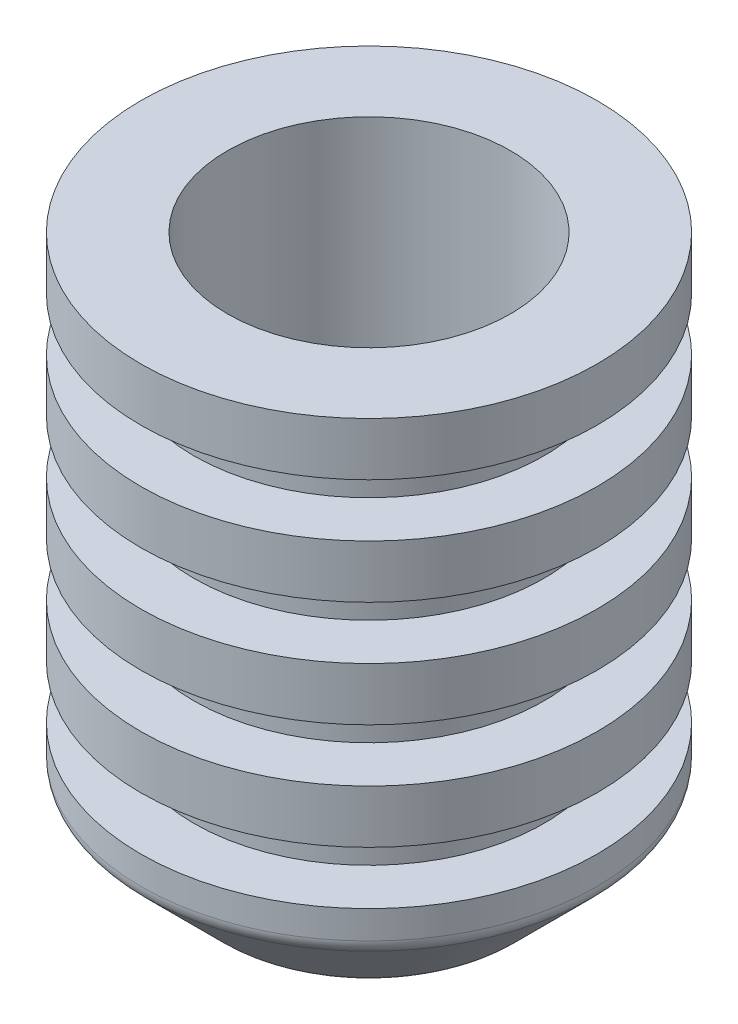
ISO-10303-21;
HEADER;
FILE_DESCRIPTION(('STEP AP214'),'2;1');
FILE_NAME('part.step','',(''),(''),'','','');
FILE_SCHEMA(('AUTOMOTIVE_DESIGN { 1 0 10303 214 1 1 1 1 }'));
ENDSEC;
DATA;
#1=APPLICATION_CONTEXT('core data for automotive mechanical design processes');
#2=APPLICATION_PROTOCOL_DEFINITION('international standard','automotive_design',2000,#1);
#3=PRODUCT_CONTEXT('',#1,'mechanical');
#4=PRODUCT('Part','Part','',(#3));
#5=PRODUCT_RELATED_PRODUCT_CATEGORY('part','',(#4));
#6=PRODUCT_DEFINITION_FORMATION('','',#4);
#7=PRODUCT_DEFINITION_CONTEXT('part definition',#1,'design');
#8=PRODUCT_DEFINITION('design','',#6,#7);
#9=PRODUCT_DEFINITION_SHAPE('','',#8);
#10=(LENGTH_UNIT() NAMED_UNIT(*) SI_UNIT(.MILLI.,.METRE.));
#11=(NAMED_UNIT(*) PLANE_ANGLE_UNIT() SI_UNIT($,.RADIAN.));
#12=(NAMED_UNIT(*) SI_UNIT($,.STERADIAN.) SOLID_ANGLE_UNIT());
#13=UNCERTAINTY_MEASURE_WITH_UNIT(LENGTH_MEASURE(1.E-05),#10,'distance_accuracy_value','');
#14=(GEOMETRIC_REPRESENTATION_CONTEXT(3) GLOBAL_UNCERTAINTY_ASSIGNED_CONTEXT((#13)) GLOBAL_UNIT_ASSIGNED_CONTEXT((#10,
#11,#12)) REPRESENTATION_CONTEXT('',''));
#15=CARTESIAN_POINT('',(0.,0.,0.));
#16=DIRECTION('',(0.,0.,1.));
#17=DIRECTION('',(1.,0.,0.));
#18=AXIS2_PLACEMENT_3D('',#15,#16,#17);
#19=CARTESIAN_POINT('',(0.,31.,0.));
#20=DIRECTION('',(0.,-1.,0.));
#21=DIRECTION('',(0.,0.,-1.));
#22=AXIS2_PLACEMENT_3D('',#19,#20,#21);
#23=CYLINDRICAL_SURFACE('',#22,12.9);
#24=CARTESIAN_POINT('',(0.,7.00000000000001,0.));
#25=DIRECTION('',(0.,-1.,0.));
#26=DIRECTION('',(0.,0.,-1.));
#27=AXIS2_PLACEMENT_3D('',#24,#25,#26);
#28=CIRCLE('',#27,12.9);
#29=CARTESIAN_POINT('',(0.,7.00000000000001,-12.9));
#30=VERTEX_POINT('',#29);
#31=EDGE_CURVE('E66',#30,#30,#28,.T.);
#32=ORIENTED_EDGE('',*,*,#31,.T.);
#33=EDGE_LOOP('',(#32));
#34=FACE_BOUND('',#33,.T.);
#35=CARTESIAN_POINT('',(0.,5.41421356237311,0.));
#36=DIRECTION('',(0.,-1.,0.));
#37=DIRECTION('',(0.,0.,-1.));
#38=AXIS2_PLACEMENT_3D('',#35,#36,#37);
#39=CIRCLE('',#38,12.9);
#40=CARTESIAN_POINT('',(0.,5.41421356237311,-12.9));
#41=VERTEX_POINT('',#40);
#42=EDGE_CURVE('E51',#41,#41,#39,.F.);
#43=ORIENTED_EDGE('',*,*,#42,.T.);
#44=EDGE_LOOP('',(#43));
#45=FACE_BOUND('',#44,.T.);
#46=ADVANCED_FACE('F36',(#34,#45),#23,.T.);
#47=CARTESIAN_POINT('',(0.,0.,0.));
#48=DIRECTION('',(0.,1.,0.));
#49=DIRECTION('',(0.,0.,1.));
#50=AXIS2_PLACEMENT_3D('',#47,#48,#49);
#51=PLANE('',#50);
#52=CARTESIAN_POINT('',(0.,0.,0.));
#53=DIRECTION('',(0.,1.,0.));
#54=DIRECTION('',(0.,0.,1.));
#55=AXIS2_PLACEMENT_3D('',#52,#53,#54);
#56=CIRCLE('',#55,7.48578643762688);
#57=CARTESIAN_POINT('',(0.,0.,7.48578643762688));
#58=VERTEX_POINT('',#57);
#59=EDGE_CURVE('E10',#58,#58,#56,.F.);
#60=ORIENTED_EDGE('',*,*,#59,.T.);
#61=EDGE_LOOP('',(#60));
#62=FACE_BOUND('',#61,.T.);
#63=ADVANCED_FACE('F150',(#62),#51,.F.);
#64=CARTESIAN_POINT('',(0.,5.00000000000001,0.));
#65=DIRECTION('',(0.,1.,0.));
#66=DIRECTION('',(0.,0.,1.));
#67=AXIS2_PLACEMENT_3D('',#64,#65,#66);
#68=CONICAL_SURFACE('',#67,12.9,0.78539816339745);
#69=CARTESIAN_POINT('',(0.,4.70710678118656,0.));
#70=DIRECTION('',(0.,1.,0.));
#71=DIRECTION('',(0.,0.,1.));
#72=AXIS2_PLACEMENT_3D('',#69,#70,#71);
#73=CIRCLE('',#72,12.6071067811866);
#74=CARTESIAN_POINT('',(0.,4.70710678118656,12.6071067811866));
#75=VERTEX_POINT('',#74);
#76=EDGE_CURVE('E43',#75,#75,#73,.F.);
#77=ORIENTED_EDGE('',*,*,#76,.T.);
#78=EDGE_LOOP('',(#77));
#79=FACE_BOUND('',#78,.T.);
#80=CARTESIAN_POINT('',(0.,0.292893218813451,0.));
#81=DIRECTION('',(0.,1.,0.));
#82=DIRECTION('',(0.,0.,1.));
#83=AXIS2_PLACEMENT_3D('',#80,#81,#82);
#84=CIRCLE('',#83,8.19289321881343);
#85=CARTESIAN_POINT('',(0.,0.292893218813451,8.19289321881343));
#86=VERTEX_POINT('',#85);
#87=EDGE_CURVE('E47',#86,#86,#84,.T.);
#88=ORIENTED_EDGE('',*,*,#87,.T.);
#89=EDGE_LOOP('',(#88));
#90=FACE_BOUND('',#89,.T.);
#91=ADVANCED_FACE('F156',(#79,#90),#68,.T.);
#92=CARTESIAN_POINT('',(0.,5.41421356237311,0.));
#93=DIRECTION('',(0.,-1.,0.));
#94=DIRECTION('',(0.,0.,-1.));
#95=AXIS2_PLACEMENT_3D('',#92,#93,#94);
#96=TOROIDAL_SURFACE('',#95,11.9,1.);
#97=ORIENTED_EDGE('',*,*,#76,.F.);
#98=EDGE_LOOP('',(#97));
#99=FACE_BOUND('',#98,.T.);
#100=ORIENTED_EDGE('',*,*,#42,.F.);
#101=EDGE_LOOP('',(#100));
#102=FACE_BOUND('',#101,.T.);
#103=ADVANCED_FACE('F324',(#99,#102),#96,.T.);
#104=CARTESIAN_POINT('',(0.,1.,0.));
#105=DIRECTION('',(0.,1.,0.));
#106=DIRECTION('',(0.,0.,1.));
#107=AXIS2_PLACEMENT_3D('',#104,#105,#106);
#108=TOROIDAL_SURFACE('',#107,7.48578643762688,1.);
#109=ORIENTED_EDGE('',*,*,#87,.F.);
#110=EDGE_LOOP('',(#109));
#111=FACE_BOUND('',#110,.T.);
#112=ORIENTED_EDGE('',*,*,#59,.F.);
#113=EDGE_LOOP('',(#112));
#114=FACE_BOUND('',#113,.T.);
#115=ADVANCED_FACE('F38',(#111,#114),#108,.T.);
#116=CARTESIAN_POINT('',(12.9,7.00000000000001,0.));
#117=DIRECTION('',(0.,-1.,0.));
#118=DIRECTION('',(0.,0.,-1.));
#119=AXIS2_PLACEMENT_3D('',#116,#117,#118);
#120=PLANE('',#119);
#121=ORIENTED_EDGE('',*,*,#31,.F.);
#122=EDGE_LOOP('',(#121));
#123=FACE_BOUND('',#122,.T.);
#124=CARTESIAN_POINT('',(0.,7.00000000000001,0.));
#125=DIRECTION('',(0.,-1.,0.));
#126=DIRECTION('',(0.,0.,-1.));
#127=AXIS2_PLACEMENT_3D('',#124,#125,#126);
#128=CIRCLE('',#127,9.9);
#129=CARTESIAN_POINT('',(0.,7.00000000000001,-9.9));
#130=VERTEX_POINT('',#129);
#131=EDGE_CURVE('E76',#130,#130,#128,.T.);
#132=ORIENTED_EDGE('',*,*,#131,.T.);
#133=EDGE_LOOP('',(#132));
#134=FACE_BOUND('',#133,.T.);
#135=ADVANCED_FACE('F203',(#123,#134),#120,.F.);
#136=CARTESIAN_POINT('',(12.9,10.,0.));
#137=DIRECTION('',(0.,1.,0.));
#138=DIRECTION('',(0.,0.,1.));
#139=AXIS2_PLACEMENT_3D('',#136,#137,#138);
#140=PLANE('',#139);
#141=CARTESIAN_POINT('',(0.,10.,0.));
#142=DIRECTION('',(0.,-1.,0.));
#143=DIRECTION('',(0.,0.,-1.));
#144=AXIS2_PLACEMENT_3D('',#141,#142,#143);
#145=CIRCLE('',#144,9.9);
#146=CARTESIAN_POINT('',(0.,10.,-9.9));
#147=VERTEX_POINT('',#146);
#148=EDGE_CURVE('E73',#147,#147,#145,.T.);
#149=ORIENTED_EDGE('',*,*,#148,.F.);
#150=EDGE_LOOP('',(#149));
#151=FACE_BOUND('',#150,.T.);
#152=CARTESIAN_POINT('',(0.,10.,0.));
#153=DIRECTION('',(0.,-1.,0.));
#154=DIRECTION('',(0.,0.,-1.));
#155=AXIS2_PLACEMENT_3D('',#152,#153,#154);
#156=CIRCLE('',#155,12.9);
#157=CARTESIAN_POINT('',(0.,10.,-12.9));
#158=VERTEX_POINT('',#157);
#159=EDGE_CURVE('E70',#158,#158,#156,.T.);
#160=ORIENTED_EDGE('',*,*,#159,.T.);
#161=EDGE_LOOP('',(#160));
#162=FACE_BOUND('',#161,.T.);
#163=ADVANCED_FACE('F173',(#151,#162),#140,.F.);
#164=CARTESIAN_POINT('',(0.,0.,0.));
#165=DIRECTION('',(0.,-1.,0.));
#166=DIRECTION('',(0.,0.,-1.));
#167=AXIS2_PLACEMENT_3D('',#164,#165,#166);
#168=CYLINDRICAL_SURFACE('',#167,9.9);
#169=ORIENTED_EDGE('',*,*,#131,.F.);
#170=EDGE_LOOP('',(#169));
#171=FACE_BOUND('',#170,.T.);
#172=ORIENTED_EDGE('',*,*,#148,.T.);
#173=EDGE_LOOP('',(#172));
#174=FACE_BOUND('',#173,.T.);
#175=ADVANCED_FACE('F164',(#171,#174),#168,.T.);
#176=CARTESIAN_POINT('',(0.,13.,0.));
#177=DIRECTION('',(0.,-1.,0.));
#178=DIRECTION('',(0.,0.,-1.));
#179=AXIS2_PLACEMENT_3D('',#176,#177,#178);
#180=CIRCLE('',#179,12.9);
#181=CARTESIAN_POINT('',(0.,13.,-12.9));
#182=VERTEX_POINT('',#181);
#183=EDGE_CURVE('E79',#182,#182,#180,.T.);
#184=ORIENTED_EDGE('',*,*,#183,.T.);
#185=EDGE_LOOP('',(#184));
#186=FACE_BOUND('',#185,.T.);
#187=ORIENTED_EDGE('',*,*,#159,.F.);
#188=EDGE_LOOP('',(#187));
#189=FACE_BOUND('',#188,.T.);
#190=ADVANCED_FACE('F152',(#186,#189),#23,.T.);
#191=CARTESIAN_POINT('',(12.9,13.,0.));
#192=DIRECTION('',(0.,-1.,0.));
#193=DIRECTION('',(0.,0.,-1.));
#194=AXIS2_PLACEMENT_3D('',#191,#192,#193);
#195=PLANE('',#194);
#196=ORIENTED_EDGE('',*,*,#183,.F.);
#197=EDGE_LOOP('',(#196));
#198=FACE_BOUND('',#197,.T.);
#199=CARTESIAN_POINT('',(0.,13.,0.));
#200=DIRECTION('',(0.,-1.,0.));
#201=DIRECTION('',(0.,0.,-1.));
#202=AXIS2_PLACEMENT_3D('',#199,#200,#201);
#203=CIRCLE('',#202,9.9);
#204=CARTESIAN_POINT('',(0.,13.,-9.9));
#205=VERTEX_POINT('',#204);
#206=EDGE_CURVE('E69',#205,#205,#203,.T.);
#207=ORIENTED_EDGE('',*,*,#206,.T.);
#208=EDGE_LOOP('',(#207));
#209=FACE_BOUND('',#208,.T.);
#210=ADVANCED_FACE('F163',(#198,#209),#195,.F.);
#211=CARTESIAN_POINT('',(12.9,16.,0.));
#212=DIRECTION('',(0.,1.,0.));
#213=DIRECTION('',(0.,0.,1.));
#214=AXIS2_PLACEMENT_3D('',#211,#212,#213);
#215=PLANE('',#214);
#216=CARTESIAN_POINT('',(0.,16.,0.));
#217=DIRECTION('',(0.,-1.,0.));
#218=DIRECTION('',(0.,0.,-1.));
#219=AXIS2_PLACEMENT_3D('',#216,#217,#218);
#220=CIRCLE('',#219,9.9);
#221=CARTESIAN_POINT('',(0.,16.,-9.9));
#222=VERTEX_POINT('',#221);
#223=EDGE_CURVE('E86',#222,#222,#220,.T.);
#224=ORIENTED_EDGE('',*,*,#223,.F.);
#225=EDGE_LOOP('',(#224));
#226=FACE_BOUND('',#225,.T.);
#227=CARTESIAN_POINT('',(0.,16.,0.));
#228=DIRECTION('',(0.,-1.,0.));
#229=DIRECTION('',(0.,0.,-1.));
#230=AXIS2_PLACEMENT_3D('',#227,#228,#229);
#231=CIRCLE('',#230,12.9);
#232=CARTESIAN_POINT('',(0.,16.,-12.9));
#233=VERTEX_POINT('',#232);
#234=EDGE_CURVE('E83',#233,#233,#231,.T.);
#235=ORIENTED_EDGE('',*,*,#234,.T.);
#236=EDGE_LOOP('',(#235));
#237=FACE_BOUND('',#236,.T.);
#238=ADVANCED_FACE('F170',(#226,#237),#215,.F.);
#239=CARTESIAN_POINT('',(0.,0.,0.));
#240=DIRECTION('',(0.,-1.,0.));
#241=DIRECTION('',(0.,0.,-1.));
#242=AXIS2_PLACEMENT_3D('',#239,#240,#241);
#243=CYLINDRICAL_SURFACE('',#242,9.9);
#244=ORIENTED_EDGE('',*,*,#206,.F.);
#245=EDGE_LOOP('',(#244));
#246=FACE_BOUND('',#245,.T.);
#247=ORIENTED_EDGE('',*,*,#223,.T.);
#248=EDGE_LOOP('',(#247));
#249=FACE_BOUND('',#248,.T.);
#250=ADVANCED_FACE('F179',(#246,#249),#243,.T.);
#251=CARTESIAN_POINT('',(0.,19.,0.));
#252=DIRECTION('',(0.,-1.,0.));
#253=DIRECTION('',(0.,0.,-1.));
#254=AXIS2_PLACEMENT_3D('',#251,#252,#253);
#255=CIRCLE('',#254,12.9);
#256=CARTESIAN_POINT('',(0.,19.,-12.9));
#257=VERTEX_POINT('',#256);
#258=EDGE_CURVE('E91',#257,#257,#255,.T.);
#259=ORIENTED_EDGE('',*,*,#258,.T.);
#260=EDGE_LOOP('',(#259));
#261=FACE_BOUND('',#260,.T.);
#262=ORIENTED_EDGE('',*,*,#234,.F.);
#263=EDGE_LOOP('',(#262));
#264=FACE_BOUND('',#263,.T.);
#265=ADVANCED_FACE('F134',(#261,#264),#23,.T.);
#266=CARTESIAN_POINT('',(12.9,19.,0.));
#267=DIRECTION('',(0.,-1.,0.));
#268=DIRECTION('',(0.,0.,-1.));
#269=AXIS2_PLACEMENT_3D('',#266,#267,#268);
#270=PLANE('',#269);
#271=ORIENTED_EDGE('',*,*,#258,.F.);
#272=EDGE_LOOP('',(#271));
#273=FACE_BOUND('',#272,.T.);
#274=CARTESIAN_POINT('',(0.,19.,0.));
#275=DIRECTION('',(0.,-1.,0.));
#276=DIRECTION('',(0.,0.,-1.));
#277=AXIS2_PLACEMENT_3D('',#274,#275,#276);
#278=CIRCLE('',#277,9.9);
#279=CARTESIAN_POINT('',(0.,19.,-9.9));
#280=VERTEX_POINT('',#279);
#281=EDGE_CURVE('E82',#280,#280,#278,.T.);
#282=ORIENTED_EDGE('',*,*,#281,.T.);
#283=EDGE_LOOP('',(#282));
#284=FACE_BOUND('',#283,.T.);
#285=ADVANCED_FACE('F178',(#273,#284),#270,.F.);
#286=CARTESIAN_POINT('',(12.9,22.,0.));
#287=DIRECTION('',(0.,1.,0.));
#288=DIRECTION('',(0.,0.,1.));
#289=AXIS2_PLACEMENT_3D('',#286,#287,#288);
#290=PLANE('',#289);
#291=CARTESIAN_POINT('',(0.,22.,0.));
#292=DIRECTION('',(0.,-1.,0.));
#293=DIRECTION('',(0.,0.,-1.));
#294=AXIS2_PLACEMENT_3D('',#291,#292,#293);
#295=CIRCLE('',#294,9.9);
#296=CARTESIAN_POINT('',(0.,22.,-9.9));
#297=VERTEX_POINT('',#296);
#298=EDGE_CURVE('E98',#297,#297,#295,.T.);
#299=ORIENTED_EDGE('',*,*,#298,.F.);
#300=EDGE_LOOP('',(#299));
#301=FACE_BOUND('',#300,.T.);
#302=CARTESIAN_POINT('',(0.,22.,0.));
#303=DIRECTION('',(0.,-1.,0.));
#304=DIRECTION('',(0.,0.,-1.));
#305=AXIS2_PLACEMENT_3D('',#302,#303,#304);
#306=CIRCLE('',#305,12.9);
#307=CARTESIAN_POINT('',(0.,22.,-12.9));
#308=VERTEX_POINT('',#307);
#309=EDGE_CURVE('E95',#308,#308,#306,.T.);
#310=ORIENTED_EDGE('',*,*,#309,.T.);
#311=EDGE_LOOP('',(#310));
#312=FACE_BOUND('',#311,.T.);
#313=ADVANCED_FACE('F185',(#301,#312),#290,.F.);
#314=CARTESIAN_POINT('',(0.,0.,0.));
#315=DIRECTION('',(0.,-1.,0.));
#316=DIRECTION('',(0.,0.,-1.));
#317=AXIS2_PLACEMENT_3D('',#314,#315,#316);
#318=CYLINDRICAL_SURFACE('',#317,9.9);
#319=ORIENTED_EDGE('',*,*,#281,.F.);
#320=EDGE_LOOP('',(#319));
#321=FACE_BOUND('',#320,.T.);
#322=ORIENTED_EDGE('',*,*,#298,.T.);
#323=EDGE_LOOP('',(#322));
#324=FACE_BOUND('',#323,.T.);
#325=ADVANCED_FACE('F160',(#321,#324),#318,.T.);
#326=CARTESIAN_POINT('',(0.,25.,0.));
#327=DIRECTION('',(0.,-1.,0.));
#328=DIRECTION('',(0.,0.,-1.));
#329=AXIS2_PLACEMENT_3D('',#326,#327,#328);
#330=CIRCLE('',#329,12.9);
#331=CARTESIAN_POINT('',(0.,25.,-12.9));
#332=VERTEX_POINT('',#331);
#333=EDGE_CURVE('E108',#332,#332,#330,.T.);
#334=ORIENTED_EDGE('',*,*,#333,.T.);
#335=EDGE_LOOP('',(#334));
#336=FACE_BOUND('',#335,.T.);
#337=ORIENTED_EDGE('',*,*,#309,.F.);
#338=EDGE_LOOP('',(#337));
#339=FACE_BOUND('',#338,.T.);
#340=ADVANCED_FACE('F120',(#336,#339),#23,.T.);
#341=CARTESIAN_POINT('',(0.,0.,0.));
#342=DIRECTION('',(0.,-1.,0.));
#343=DIRECTION('',(0.,0.,-1.));
#344=AXIS2_PLACEMENT_3D('',#341,#342,#343);
#345=CYLINDRICAL_SURFACE('',#344,9.9);
#346=CARTESIAN_POINT('',(0.,25.,0.));
#347=DIRECTION('',(0.,-1.,0.));
#348=DIRECTION('',(0.,0.,-1.));
#349=AXIS2_PLACEMENT_3D('',#346,#347,#348);
#350=CIRCLE('',#349,9.9);
#351=CARTESIAN_POINT('',(0.,25.,-9.9));
#352=VERTEX_POINT('',#351);
#353=EDGE_CURVE('E94',#352,#352,#350,.T.);
#354=ORIENTED_EDGE('',*,*,#353,.F.);
#355=EDGE_LOOP('',(#354));
#356=FACE_BOUND('',#355,.T.);
#357=CARTESIAN_POINT('',(0.,28.,0.));
#358=DIRECTION('',(0.,-1.,0.));
#359=DIRECTION('',(0.,0.,-1.));
#360=AXIS2_PLACEMENT_3D('',#357,#358,#359);
#361=CIRCLE('',#360,9.9);
#362=CARTESIAN_POINT('',(0.,28.,-9.9));
#363=VERTEX_POINT('',#362);
#364=EDGE_CURVE('E63',#363,#363,#361,.T.);
#365=ORIENTED_EDGE('',*,*,#364,.T.);
#366=EDGE_LOOP('',(#365));
#367=FACE_BOUND('',#366,.T.);
#368=ADVANCED_FACE('F116',(#356,#367),#345,.T.);
#369=CARTESIAN_POINT('',(12.9,28.,0.));
#370=DIRECTION('',(0.,1.,0.));
#371=DIRECTION('',(0.,0.,1.));
#372=AXIS2_PLACEMENT_3D('',#369,#370,#371);
#373=PLANE('',#372);
#374=ORIENTED_EDGE('',*,*,#364,.F.);
#375=EDGE_LOOP('',(#374));
#376=FACE_BOUND('',#375,.T.);
#377=CARTESIAN_POINT('',(0.,28.,0.));
#378=DIRECTION('',(0.,-1.,0.));
#379=DIRECTION('',(0.,0.,-1.));
#380=AXIS2_PLACEMENT_3D('',#377,#378,#379);
#381=CIRCLE('',#380,12.9);
#382=CARTESIAN_POINT('',(0.,28.,-12.9));
#383=VERTEX_POINT('',#382);
#384=EDGE_CURVE('E105',#383,#383,#381,.T.);
#385=ORIENTED_EDGE('',*,*,#384,.T.);
#386=EDGE_LOOP('',(#385));
#387=FACE_BOUND('',#386,.T.);
#388=ADVANCED_FACE('F119',(#376,#387),#373,.F.);
#389=CARTESIAN_POINT('',(12.9,25.,0.));
#390=DIRECTION('',(0.,-1.,0.));
#391=DIRECTION('',(0.,0.,-1.));
#392=AXIS2_PLACEMENT_3D('',#389,#390,#391);
#393=PLANE('',#392);
#394=ORIENTED_EDGE('',*,*,#333,.F.);
#395=EDGE_LOOP('',(#394));
#396=FACE_BOUND('',#395,.T.);
#397=ORIENTED_EDGE('',*,*,#353,.T.);
#398=EDGE_LOOP('',(#397));
#399=FACE_BOUND('',#398,.T.);
#400=ADVANCED_FACE('F114',(#396,#399),#393,.F.);
#401=CARTESIAN_POINT('',(0.,6.,0.));
#402=DIRECTION('',(0.,1.,0.));
#403=DIRECTION('',(0.,0.,1.));
#404=AXIS2_PLACEMENT_3D('',#401,#402,#403);
#405=PLANE('',#404);
#406=CARTESIAN_POINT('',(0.,6.,0.));
#407=DIRECTION('',(0.,1.,0.));
#408=DIRECTION('',(0.,0.,1.));
#409=AXIS2_PLACEMENT_3D('',#406,#407,#408);
#410=CIRCLE('',#409,8.);
#411=CARTESIAN_POINT('',(0.,6.,8.));
#412=VERTEX_POINT('',#411);
#413=EDGE_CURVE('E59',#412,#412,#410,.T.);
#414=ORIENTED_EDGE('',*,*,#413,.T.);
#415=EDGE_LOOP('',(#414));
#416=FACE_BOUND('',#415,.T.);
#417=ADVANCED_FACE('F144',(#416),#405,.T.);
#418=CARTESIAN_POINT('',(0.,6.,0.));
#419=DIRECTION('',(0.,1.,0.));
#420=DIRECTION('',(0.,0.,1.));
#421=AXIS2_PLACEMENT_3D('',#418,#419,#420);
#422=CYLINDRICAL_SURFACE('',#421,8.);
#423=ORIENTED_EDGE('',*,*,#413,.F.);
#424=EDGE_LOOP('',(#423));
#425=FACE_BOUND('',#424,.T.);
#426=CARTESIAN_POINT('',(0.,31.,0.));
#427=DIRECTION('',(0.,1.,0.));
#428=DIRECTION('',(0.,0.,1.));
#429=AXIS2_PLACEMENT_3D('',#426,#427,#428);
#430=CIRCLE('',#429,8.);
#431=CARTESIAN_POINT('',(0.,31.,8.));
#432=VERTEX_POINT('',#431);
#433=EDGE_CURVE('E60',#432,#432,#430,.T.);
#434=ORIENTED_EDGE('',*,*,#433,.T.);
#435=EDGE_LOOP('',(#434));
#436=FACE_BOUND('',#435,.T.);
#437=ADVANCED_FACE('F138',(#425,#436),#422,.F.);
#438=CARTESIAN_POINT('',(0.,31.,0.));
#439=DIRECTION('',(0.,1.,0.));
#440=DIRECTION('',(0.,0.,1.));
#441=AXIS2_PLACEMENT_3D('',#438,#439,#440);
#442=PLANE('',#441);
#443=ORIENTED_EDGE('',*,*,#433,.F.);
#444=EDGE_LOOP('',(#443));
#445=FACE_BOUND('',#444,.T.);
#446=CARTESIAN_POINT('',(0.,31.,0.));
#447=DIRECTION('',(0.,1.,0.));
#448=DIRECTION('',(0.,0.,1.));
#449=AXIS2_PLACEMENT_3D('',#446,#447,#448);
#450=CIRCLE('',#449,12.9);
#451=CARTESIAN_POINT('',(0.,31.,12.9));
#452=VERTEX_POINT('',#451);
#453=EDGE_CURVE('E56',#452,#452,#450,.T.);
#454=ORIENTED_EDGE('',*,*,#453,.T.);
#455=EDGE_LOOP('',(#454));
#456=FACE_BOUND('',#455,.T.);
#457=ADVANCED_FACE('F132',(#445,#456),#442,.T.);
#458=ORIENTED_EDGE('',*,*,#384,.F.);
#459=EDGE_LOOP('',(#458));
#460=FACE_BOUND('',#459,.T.);
#461=ORIENTED_EDGE('',*,*,#453,.F.);
#462=EDGE_LOOP('',(#461));
#463=FACE_BOUND('',#462,.T.);
#464=ADVANCED_FACE('F129',(#460,#463),#23,.T.);
#465=CLOSED_SHELL('',(#46,#63,#91,#103,#115,#135,#163,#175,#190,#210,#238,#250,#265,#285,#313,
#325,#340,#368,#388,#400,#417,#437,#457,#464));
#466=MANIFOLD_SOLID_BREP('B2',#465);
#467=ADVANCED_BREP_SHAPE_REPRESENTATION('',(#18,#466),#14);
#468=SHAPE_DEFINITION_REPRESENTATION(#9,#467);
ENDSEC;
END-ISO-10303-21;
